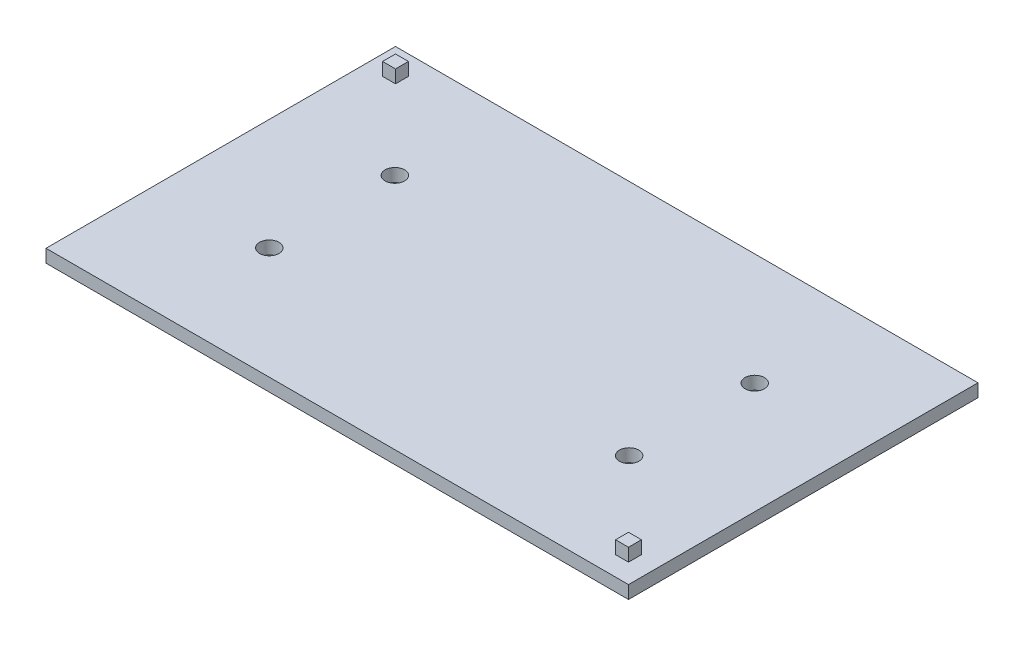
ISO-10303-21;
HEADER;
FILE_DESCRIPTION(('STEP AP214'),'2;1');
FILE_NAME('part.step','',(''),(''),'','','');
FILE_SCHEMA(('AUTOMOTIVE_DESIGN { 1 0 10303 214 1 1 1 1 }'));
ENDSEC;
DATA;
#1=APPLICATION_CONTEXT('core data for automotive mechanical design processes');
#2=APPLICATION_PROTOCOL_DEFINITION('international standard','automotive_design',2000,#1);
#3=PRODUCT_CONTEXT('',#1,'mechanical');
#4=PRODUCT('Part','Part','',(#3));
#5=PRODUCT_RELATED_PRODUCT_CATEGORY('part','',(#4));
#6=PRODUCT_DEFINITION_FORMATION('','',#4);
#7=PRODUCT_DEFINITION_CONTEXT('part definition',#1,'design');
#8=PRODUCT_DEFINITION('design','',#6,#7);
#9=PRODUCT_DEFINITION_SHAPE('','',#8);
#10=(LENGTH_UNIT() NAMED_UNIT(*) SI_UNIT(.MILLI.,.METRE.));
#11=(NAMED_UNIT(*) PLANE_ANGLE_UNIT() SI_UNIT($,.RADIAN.));
#12=(NAMED_UNIT(*) SI_UNIT($,.STERADIAN.) SOLID_ANGLE_UNIT());
#13=UNCERTAINTY_MEASURE_WITH_UNIT(LENGTH_MEASURE(1.E-05),#10,'distance_accuracy_value','');
#14=(GEOMETRIC_REPRESENTATION_CONTEXT(3) GLOBAL_UNCERTAINTY_ASSIGNED_CONTEXT((#13)) GLOBAL_UNIT_ASSIGNED_CONTEXT((#10,
#11,#12)) REPRESENTATION_CONTEXT('',''));
#15=CARTESIAN_POINT('',(0.,0.,0.));
#16=DIRECTION('',(0.,0.,1.));
#17=DIRECTION('',(1.,0.,0.));
#18=AXIS2_PLACEMENT_3D('',#15,#16,#17);
#19=CARTESIAN_POINT('',(0.,3.,0.));
#20=DIRECTION('',(0.,-1.,0.));
#21=DIRECTION('',(0.,0.,-1.));
#22=AXIS2_PLACEMENT_3D('',#19,#20,#21);
#23=PLANE('',#22);
#24=DIRECTION('',(1.,0.,0.));
#25=VECTOR('',#24,1.);
#26=CARTESIAN_POINT('',(0.,3.,-24.));
#27=LINE('',#26,#25);
#28=CARTESIAN_POINT('',(-42.,3.,-24.));
#29=VERTEX_POINT('',#28);
#30=CARTESIAN_POINT('',(-40.,3.,-24.));
#31=VERTEX_POINT('',#30);
#32=EDGE_CURVE('E110',#29,#31,#27,.T.);
#33=ORIENTED_EDGE('',*,*,#32,.T.);
#34=DIRECTION('',(0.,0.,1.));
#35=VECTOR('',#34,1.);
#36=CARTESIAN_POINT('',(-40.,3.,0.));
#37=LINE('',#36,#35);
#38=CARTESIAN_POINT('',(-40.,3.,-22.));
#39=VERTEX_POINT('',#38);
#40=EDGE_CURVE('E213',#31,#39,#37,.T.);
#41=ORIENTED_EDGE('',*,*,#40,.T.);
#42=DIRECTION('',(1.,0.,0.));
#43=VECTOR('',#42,1.);
#44=CARTESIAN_POINT('',(0.,3.,-22.));
#45=LINE('',#44,#43);
#46=CARTESIAN_POINT('',(-42.,3.,-22.));
#47=VERTEX_POINT('',#46);
#48=EDGE_CURVE('E198',#47,#39,#45,.T.);
#49=ORIENTED_EDGE('',*,*,#48,.F.);
#50=DIRECTION('',(0.,0.,1.));
#51=VECTOR('',#50,1.);
#52=CARTESIAN_POINT('',(-42.,3.,0.));
#53=LINE('',#52,#51);
#54=EDGE_CURVE('E115',#29,#47,#53,.T.);
#55=ORIENTED_EDGE('',*,*,#54,.F.);
#56=EDGE_LOOP('',(#33,#41,#49,#55));
#57=FACE_BOUND('',#56,.T.);
#58=DIRECTION('',(1.,0.,0.));
#59=VECTOR('',#58,1.);
#60=CARTESIAN_POINT('',(0.,3.,24.));
#61=LINE('',#60,#59);
#62=CARTESIAN_POINT('',(40.,3.,24.));
#63=VERTEX_POINT('',#62);
#64=CARTESIAN_POINT('',(42.,3.,24.));
#65=VERTEX_POINT('',#64);
#66=EDGE_CURVE('E242',#63,#65,#61,.T.);
#67=ORIENTED_EDGE('',*,*,#66,.F.);
#68=DIRECTION('',(0.,0.,-1.));
#69=VECTOR('',#68,1.);
#70=CARTESIAN_POINT('',(40.,3.,0.));
#71=LINE('',#70,#69);
#72=CARTESIAN_POINT('',(40.,3.,22.));
#73=VERTEX_POINT('',#72);
#74=EDGE_CURVE('E245',#63,#73,#71,.T.);
#75=ORIENTED_EDGE('',*,*,#74,.T.);
#76=DIRECTION('',(-1.,0.,0.));
#77=VECTOR('',#76,1.);
#78=CARTESIAN_POINT('',(0.,3.,22.));
#79=LINE('',#78,#77);
#80=CARTESIAN_POINT('',(42.,3.,22.));
#81=VERTEX_POINT('',#80);
#82=EDGE_CURVE('E237',#81,#73,#79,.T.);
#83=ORIENTED_EDGE('',*,*,#82,.F.);
#84=DIRECTION('',(0.,0.,1.));
#85=VECTOR('',#84,1.);
#86=CARTESIAN_POINT('',(42.,3.,0.));
#87=LINE('',#86,#85);
#88=EDGE_CURVE('E240',#81,#65,#87,.T.);
#89=ORIENTED_EDGE('',*,*,#88,.T.);
#90=EDGE_LOOP('',(#67,#75,#83,#89));
#91=FACE_BOUND('',#90,.T.);
#92=DIRECTION('',(1.,0.,0.));
#93=VECTOR('',#92,1.);
#94=CARTESIAN_POINT('',(-45.,3.,27.));
#95=LINE('',#94,#93);
#96=CARTESIAN_POINT('',(-45.,3.,27.));
#97=VERTEX_POINT('',#96);
#98=CARTESIAN_POINT('',(45.,3.,27.));
#99=VERTEX_POINT('',#98);
#100=EDGE_CURVE('E272',#97,#99,#95,.T.);
#101=ORIENTED_EDGE('',*,*,#100,.T.);
#102=DIRECTION('',(0.,0.,1.));
#103=VECTOR('',#102,1.);
#104=CARTESIAN_POINT('',(45.,3.,-27.));
#105=LINE('',#104,#103);
#106=CARTESIAN_POINT('',(45.,3.,-27.));
#107=VERTEX_POINT('',#106);
#108=EDGE_CURVE('E274',#107,#99,#105,.T.);
#109=ORIENTED_EDGE('',*,*,#108,.F.);
#110=DIRECTION('',(1.,0.,0.));
#111=VECTOR('',#110,1.);
#112=CARTESIAN_POINT('',(-45.,3.,-27.));
#113=LINE('',#112,#111);
#114=CARTESIAN_POINT('',(-45.,3.,-27.));
#115=VERTEX_POINT('',#114);
#116=EDGE_CURVE('E278',#115,#107,#113,.T.);
#117=ORIENTED_EDGE('',*,*,#116,.F.);
#118=DIRECTION('',(0.,0.,1.));
#119=VECTOR('',#118,1.);
#120=CARTESIAN_POINT('',(-45.,3.,-27.));
#121=LINE('',#120,#119);
#122=EDGE_CURVE('E281',#115,#97,#121,.T.);
#123=ORIENTED_EDGE('',*,*,#122,.T.);
#124=EDGE_LOOP('',(#101,#109,#117,#123));
#125=FACE_BOUND('',#124,.T.);
#126=CARTESIAN_POINT('',(-27.8,3.,-9.7));
#127=DIRECTION('',(0.,1.,0.));
#128=DIRECTION('',(0.,0.,1.));
#129=AXIS2_PLACEMENT_3D('',#126,#127,#128);
#130=CIRCLE('',#129,1.5);
#131=CARTESIAN_POINT('',(-27.8,3.,-8.2));
#132=VERTEX_POINT('',#131);
#133=EDGE_CURVE('E266',#132,#132,#130,.T.);
#134=ORIENTED_EDGE('',*,*,#133,.F.);
#135=EDGE_LOOP('',(#134));
#136=FACE_BOUND('',#135,.T.);
#137=CARTESIAN_POINT('',(-27.8,3.,9.7));
#138=DIRECTION('',(0.,1.,0.));
#139=DIRECTION('',(0.,0.,1.));
#140=AXIS2_PLACEMENT_3D('',#137,#138,#139);
#141=CIRCLE('',#140,1.5);
#142=CARTESIAN_POINT('',(-27.8,3.,11.2));
#143=VERTEX_POINT('',#142);
#144=EDGE_CURVE('E260',#143,#143,#141,.T.);
#145=ORIENTED_EDGE('',*,*,#144,.F.);
#146=EDGE_LOOP('',(#145));
#147=FACE_BOUND('',#146,.T.);
#148=CARTESIAN_POINT('',(27.8,3.,9.70000000000001));
#149=DIRECTION('',(0.,1.,0.));
#150=DIRECTION('',(0.,0.,1.));
#151=AXIS2_PLACEMENT_3D('',#148,#149,#150);
#152=CIRCLE('',#151,1.5);
#153=CARTESIAN_POINT('',(27.8,3.,11.2));
#154=VERTEX_POINT('',#153);
#155=EDGE_CURVE('E254',#154,#154,#152,.T.);
#156=ORIENTED_EDGE('',*,*,#155,.F.);
#157=EDGE_LOOP('',(#156));
#158=FACE_BOUND('',#157,.T.);
#159=CARTESIAN_POINT('',(27.8,3.,-9.7));
#160=DIRECTION('',(0.,1.,0.));
#161=DIRECTION('',(0.,0.,1.));
#162=AXIS2_PLACEMENT_3D('',#159,#160,#161);
#163=CIRCLE('',#162,1.5);
#164=CARTESIAN_POINT('',(27.8,3.,-8.2));
#165=VERTEX_POINT('',#164);
#166=EDGE_CURVE('E248',#165,#165,#163,.T.);
#167=ORIENTED_EDGE('',*,*,#166,.F.);
#168=EDGE_LOOP('',(#167));
#169=FACE_BOUND('',#168,.T.);
#170=ADVANCED_FACE('F95',(#57,#91,#125,#136,#147,#158,#169),#23,.F.);
#171=CARTESIAN_POINT('',(0.,1.,0.));
#172=DIRECTION('',(0.,-1.,0.));
#173=DIRECTION('',(0.,0.,-1.));
#174=AXIS2_PLACEMENT_3D('',#171,#172,#173);
#175=PLANE('',#174);
#176=CARTESIAN_POINT('',(27.8,1.,9.70000000000001));
#177=DIRECTION('',(0.,1.,0.));
#178=DIRECTION('',(0.,0.,1.));
#179=AXIS2_PLACEMENT_3D('',#176,#177,#178);
#180=CIRCLE('',#179,1.5);
#181=CARTESIAN_POINT('',(27.8,1.,11.2));
#182=VERTEX_POINT('',#181);
#183=EDGE_CURVE('E251',#182,#182,#180,.T.);
#184=ORIENTED_EDGE('',*,*,#183,.T.);
#185=EDGE_LOOP('',(#184));
#186=FACE_BOUND('',#185,.T.);
#187=CARTESIAN_POINT('',(-27.8,1.,-9.7));
#188=DIRECTION('',(0.,1.,0.));
#189=DIRECTION('',(0.,0.,1.));
#190=AXIS2_PLACEMENT_3D('',#187,#188,#189);
#191=CIRCLE('',#190,1.5);
#192=CARTESIAN_POINT('',(-27.8,1.,-8.2));
#193=VERTEX_POINT('',#192);
#194=EDGE_CURVE('E263',#193,#193,#191,.T.);
#195=ORIENTED_EDGE('',*,*,#194,.T.);
#196=EDGE_LOOP('',(#195));
#197=FACE_BOUND('',#196,.T.);
#198=DIRECTION('',(1.,0.,0.));
#199=VECTOR('',#198,1.);
#200=CARTESIAN_POINT('',(-45.,1.,27.));
#201=LINE('',#200,#199);
#202=CARTESIAN_POINT('',(-45.,1.,27.));
#203=VERTEX_POINT('',#202);
#204=CARTESIAN_POINT('',(45.,1.,27.));
#205=VERTEX_POINT('',#204);
#206=EDGE_CURVE('E269',#203,#205,#201,.T.);
#207=ORIENTED_EDGE('',*,*,#206,.F.);
#208=DIRECTION('',(0.,0.,1.));
#209=VECTOR('',#208,1.);
#210=CARTESIAN_POINT('',(-45.,1.,-27.));
#211=LINE('',#210,#209);
#212=CARTESIAN_POINT('',(-45.,1.,-27.));
#213=VERTEX_POINT('',#212);
#214=EDGE_CURVE('E275',#213,#203,#211,.T.);
#215=ORIENTED_EDGE('',*,*,#214,.F.);
#216=DIRECTION('',(1.,0.,0.));
#217=VECTOR('',#216,1.);
#218=CARTESIAN_POINT('',(-45.,1.,-27.));
#219=LINE('',#218,#217);
#220=CARTESIAN_POINT('',(45.,1.,-27.));
#221=VERTEX_POINT('',#220);
#222=EDGE_CURVE('E289',#213,#221,#219,.T.);
#223=ORIENTED_EDGE('',*,*,#222,.T.);
#224=DIRECTION('',(0.,0.,1.));
#225=VECTOR('',#224,1.);
#226=CARTESIAN_POINT('',(45.,1.,-27.));
#227=LINE('',#226,#225);
#228=EDGE_CURVE('E286',#221,#205,#227,.T.);
#229=ORIENTED_EDGE('',*,*,#228,.T.);
#230=EDGE_LOOP('',(#207,#215,#223,#229));
#231=FACE_BOUND('',#230,.T.);
#232=CARTESIAN_POINT('',(-27.8,1.,9.7));
#233=DIRECTION('',(0.,1.,0.));
#234=DIRECTION('',(0.,0.,1.));
#235=AXIS2_PLACEMENT_3D('',#232,#233,#234);
#236=CIRCLE('',#235,1.5);
#237=CARTESIAN_POINT('',(-27.8,1.,11.2));
#238=VERTEX_POINT('',#237);
#239=EDGE_CURVE('E257',#238,#238,#236,.T.);
#240=ORIENTED_EDGE('',*,*,#239,.T.);
#241=EDGE_LOOP('',(#240));
#242=FACE_BOUND('',#241,.T.);
#243=CARTESIAN_POINT('',(27.8,1.,-9.7));
#244=DIRECTION('',(0.,1.,0.));
#245=DIRECTION('',(0.,0.,1.));
#246=AXIS2_PLACEMENT_3D('',#243,#244,#245);
#247=CIRCLE('',#246,1.5);
#248=CARTESIAN_POINT('',(27.8,1.,-8.2));
#249=VERTEX_POINT('',#248);
#250=EDGE_CURVE('E247',#249,#249,#247,.T.);
#251=ORIENTED_EDGE('',*,*,#250,.T.);
#252=EDGE_LOOP('',(#251));
#253=FACE_BOUND('',#252,.T.);
#254=ADVANCED_FACE('F308',(#186,#197,#231,#242,#253),#175,.T.);
#255=CARTESIAN_POINT('',(-45.,3.,27.));
#256=DIRECTION('',(0.,0.,-1.));
#257=DIRECTION('',(-1.,0.,0.));
#258=AXIS2_PLACEMENT_3D('',#255,#256,#257);
#259=PLANE('',#258);
#260=ORIENTED_EDGE('',*,*,#206,.T.);
#261=DIRECTION('',(0.,-1.,0.));
#262=VECTOR('',#261,1.);
#263=CARTESIAN_POINT('',(45.,3.,27.));
#264=LINE('',#263,#262);
#265=EDGE_CURVE('E12',#99,#205,#264,.T.);
#266=ORIENTED_EDGE('',*,*,#265,.F.);
#267=ORIENTED_EDGE('',*,*,#100,.F.);
#268=DIRECTION('',(0.,-1.,0.));
#269=VECTOR('',#268,1.);
#270=CARTESIAN_POINT('',(-45.,3.,27.));
#271=LINE('',#270,#269);
#272=EDGE_CURVE('E283',#97,#203,#271,.T.);
#273=ORIENTED_EDGE('',*,*,#272,.T.);
#274=EDGE_LOOP('',(#260,#266,#267,#273));
#275=FACE_BOUND('',#274,.T.);
#276=ADVANCED_FACE('F97',(#275),#259,.F.);
#277=CARTESIAN_POINT('',(45.,3.,-27.));
#278=DIRECTION('',(1.,0.,0.));
#279=DIRECTION('',(0.,0.,-1.));
#280=AXIS2_PLACEMENT_3D('',#277,#278,#279);
#281=PLANE('',#280);
#282=ORIENTED_EDGE('',*,*,#228,.F.);
#283=DIRECTION('',(0.,-1.,0.));
#284=VECTOR('',#283,1.);
#285=CARTESIAN_POINT('',(45.,3.,-27.));
#286=LINE('',#285,#284);
#287=EDGE_CURVE('E103',#107,#221,#286,.T.);
#288=ORIENTED_EDGE('',*,*,#287,.F.);
#289=ORIENTED_EDGE('',*,*,#108,.T.);
#290=ORIENTED_EDGE('',*,*,#265,.T.);
#291=EDGE_LOOP('',(#282,#288,#289,#290));
#292=FACE_BOUND('',#291,.T.);
#293=ADVANCED_FACE('F303',(#292),#281,.T.);
#294=CARTESIAN_POINT('',(-45.,3.,-27.));
#295=DIRECTION('',(0.,0.,-1.));
#296=DIRECTION('',(-1.,0.,0.));
#297=AXIS2_PLACEMENT_3D('',#294,#295,#296);
#298=PLANE('',#297);
#299=ORIENTED_EDGE('',*,*,#222,.F.);
#300=DIRECTION('',(0.,-1.,0.));
#301=VECTOR('',#300,1.);
#302=CARTESIAN_POINT('',(-45.,3.,-27.));
#303=LINE('',#302,#301);
#304=EDGE_CURVE('E295',#115,#213,#303,.T.);
#305=ORIENTED_EDGE('',*,*,#304,.F.);
#306=ORIENTED_EDGE('',*,*,#116,.T.);
#307=ORIENTED_EDGE('',*,*,#287,.T.);
#308=EDGE_LOOP('',(#299,#305,#306,#307));
#309=FACE_BOUND('',#308,.T.);
#310=ADVANCED_FACE('F299',(#309),#298,.T.);
#311=CARTESIAN_POINT('',(-45.,3.,-27.));
#312=DIRECTION('',(1.,0.,0.));
#313=DIRECTION('',(0.,0.,-1.));
#314=AXIS2_PLACEMENT_3D('',#311,#312,#313);
#315=PLANE('',#314);
#316=ORIENTED_EDGE('',*,*,#214,.T.);
#317=ORIENTED_EDGE('',*,*,#272,.F.);
#318=ORIENTED_EDGE('',*,*,#122,.F.);
#319=ORIENTED_EDGE('',*,*,#304,.T.);
#320=EDGE_LOOP('',(#316,#317,#318,#319));
#321=FACE_BOUND('',#320,.T.);
#322=ADVANCED_FACE('F312',(#321),#315,.F.);
#323=CARTESIAN_POINT('',(-27.8,3.,-9.7));
#324=DIRECTION('',(0.,-1.,0.));
#325=DIRECTION('',(0.,0.,-1.));
#326=AXIS2_PLACEMENT_3D('',#323,#324,#325);
#327=CYLINDRICAL_SURFACE('',#326,1.5);
#328=ORIENTED_EDGE('',*,*,#133,.T.);
#329=EDGE_LOOP('',(#328));
#330=FACE_BOUND('',#329,.T.);
#331=ORIENTED_EDGE('',*,*,#194,.F.);
#332=EDGE_LOOP('',(#331));
#333=FACE_BOUND('',#332,.T.);
#334=ADVANCED_FACE('F347',(#330,#333),#327,.F.);
#335=CARTESIAN_POINT('',(-27.8,3.,9.7));
#336=DIRECTION('',(0.,-1.,0.));
#337=DIRECTION('',(0.,0.,-1.));
#338=AXIS2_PLACEMENT_3D('',#335,#336,#337);
#339=CYLINDRICAL_SURFACE('',#338,1.5);
#340=ORIENTED_EDGE('',*,*,#144,.T.);
#341=EDGE_LOOP('',(#340));
#342=FACE_BOUND('',#341,.T.);
#343=ORIENTED_EDGE('',*,*,#239,.F.);
#344=EDGE_LOOP('',(#343));
#345=FACE_BOUND('',#344,.T.);
#346=ADVANCED_FACE('F368',(#342,#345),#339,.F.);
#347=CARTESIAN_POINT('',(27.8,3.,9.70000000000001));
#348=DIRECTION('',(0.,-1.,0.));
#349=DIRECTION('',(0.,0.,-1.));
#350=AXIS2_PLACEMENT_3D('',#347,#348,#349);
#351=CYLINDRICAL_SURFACE('',#350,1.5);
#352=ORIENTED_EDGE('',*,*,#155,.T.);
#353=EDGE_LOOP('',(#352));
#354=FACE_BOUND('',#353,.T.);
#355=ORIENTED_EDGE('',*,*,#183,.F.);
#356=EDGE_LOOP('',(#355));
#357=FACE_BOUND('',#356,.T.);
#358=ADVANCED_FACE('F332',(#354,#357),#351,.F.);
#359=CARTESIAN_POINT('',(27.8,3.,-9.7));
#360=DIRECTION('',(0.,-1.,0.));
#361=DIRECTION('',(0.,0.,-1.));
#362=AXIS2_PLACEMENT_3D('',#359,#360,#361);
#363=CYLINDRICAL_SURFACE('',#362,1.5);
#364=ORIENTED_EDGE('',*,*,#166,.T.);
#365=EDGE_LOOP('',(#364));
#366=FACE_BOUND('',#365,.T.);
#367=ORIENTED_EDGE('',*,*,#250,.F.);
#368=EDGE_LOOP('',(#367));
#369=FACE_BOUND('',#368,.T.);
#370=ADVANCED_FACE('F328',(#366,#369),#363,.F.);
#371=CARTESIAN_POINT('',(40.,5.,0.));
#372=DIRECTION('',(-1.,0.,0.));
#373=DIRECTION('',(0.,0.,1.));
#374=AXIS2_PLACEMENT_3D('',#371,#372,#373);
#375=PLANE('',#374);
#376=ORIENTED_EDGE('',*,*,#74,.F.);
#377=DIRECTION('',(0.,-1.,0.));
#378=VECTOR('',#377,1.);
#379=CARTESIAN_POINT('',(40.,5.,24.));
#380=LINE('',#379,#378);
#381=CARTESIAN_POINT('',(40.,5.,24.));
#382=VERTEX_POINT('',#381);
#383=EDGE_CURVE('E234',#382,#63,#380,.T.);
#384=ORIENTED_EDGE('',*,*,#383,.F.);
#385=DIRECTION('',(0.,0.,-1.));
#386=VECTOR('',#385,1.);
#387=CARTESIAN_POINT('',(40.,5.,0.));
#388=LINE('',#387,#386);
#389=CARTESIAN_POINT('',(40.,5.,22.));
#390=VERTEX_POINT('',#389);
#391=EDGE_CURVE('E215',#382,#390,#388,.T.);
#392=ORIENTED_EDGE('',*,*,#391,.T.);
#393=DIRECTION('',(0.,-1.,0.));
#394=VECTOR('',#393,1.);
#395=CARTESIAN_POINT('',(40.,5.,22.));
#396=LINE('',#395,#394);
#397=EDGE_CURVE('E225',#390,#73,#396,.T.);
#398=ORIENTED_EDGE('',*,*,#397,.T.);
#399=EDGE_LOOP('',(#376,#384,#392,#398));
#400=FACE_BOUND('',#399,.T.);
#401=ADVANCED_FACE('F331',(#400),#375,.T.);
#402=CARTESIAN_POINT('',(0.,5.,24.));
#403=DIRECTION('',(0.,0.,-1.));
#404=DIRECTION('',(-1.,0.,0.));
#405=AXIS2_PLACEMENT_3D('',#402,#403,#404);
#406=PLANE('',#405);
#407=ORIENTED_EDGE('',*,*,#383,.T.);
#408=ORIENTED_EDGE('',*,*,#66,.T.);
#409=DIRECTION('',(0.,-1.,0.));
#410=VECTOR('',#409,1.);
#411=CARTESIAN_POINT('',(42.,5.,24.));
#412=LINE('',#411,#410);
#413=CARTESIAN_POINT('',(42.,5.,24.));
#414=VERTEX_POINT('',#413);
#415=EDGE_CURVE('E231',#414,#65,#412,.T.);
#416=ORIENTED_EDGE('',*,*,#415,.F.);
#417=DIRECTION('',(1.,0.,0.));
#418=VECTOR('',#417,1.);
#419=CARTESIAN_POINT('',(0.,5.,24.));
#420=LINE('',#419,#418);
#421=EDGE_CURVE('E218',#382,#414,#420,.T.);
#422=ORIENTED_EDGE('',*,*,#421,.F.);
#423=EDGE_LOOP('',(#407,#408,#416,#422));
#424=FACE_BOUND('',#423,.T.);
#425=ADVANCED_FACE('F394',(#424),#406,.F.);
#426=CARTESIAN_POINT('',(42.,5.,0.));
#427=DIRECTION('',(1.,0.,0.));
#428=DIRECTION('',(0.,0.,-1.));
#429=AXIS2_PLACEMENT_3D('',#426,#427,#428);
#430=PLANE('',#429);
#431=ORIENTED_EDGE('',*,*,#88,.F.);
#432=DIRECTION('',(0.,-1.,0.));
#433=VECTOR('',#432,1.);
#434=CARTESIAN_POINT('',(42.,5.,22.));
#435=LINE('',#434,#433);
#436=CARTESIAN_POINT('',(42.,5.,22.));
#437=VERTEX_POINT('',#436);
#438=EDGE_CURVE('E228',#437,#81,#435,.T.);
#439=ORIENTED_EDGE('',*,*,#438,.F.);
#440=DIRECTION('',(0.,0.,1.));
#441=VECTOR('',#440,1.);
#442=CARTESIAN_POINT('',(42.,5.,0.));
#443=LINE('',#442,#441);
#444=EDGE_CURVE('E220',#437,#414,#443,.T.);
#445=ORIENTED_EDGE('',*,*,#444,.T.);
#446=ORIENTED_EDGE('',*,*,#415,.T.);
#447=EDGE_LOOP('',(#431,#439,#445,#446));
#448=FACE_BOUND('',#447,.T.);
#449=ADVANCED_FACE('F402',(#448),#430,.T.);
#450=CARTESIAN_POINT('',(0.,5.,22.));
#451=DIRECTION('',(0.,0.,1.));
#452=DIRECTION('',(1.,0.,0.));
#453=AXIS2_PLACEMENT_3D('',#450,#451,#452);
#454=PLANE('',#453);
#455=ORIENTED_EDGE('',*,*,#438,.T.);
#456=ORIENTED_EDGE('',*,*,#82,.T.);
#457=ORIENTED_EDGE('',*,*,#397,.F.);
#458=DIRECTION('',(-1.,0.,0.));
#459=VECTOR('',#458,1.);
#460=CARTESIAN_POINT('',(0.,5.,22.));
#461=LINE('',#460,#459);
#462=EDGE_CURVE('E223',#437,#390,#461,.T.);
#463=ORIENTED_EDGE('',*,*,#462,.F.);
#464=EDGE_LOOP('',(#455,#456,#457,#463));
#465=FACE_BOUND('',#464,.T.);
#466=ADVANCED_FACE('F410',(#465),#454,.F.);
#467=CARTESIAN_POINT('',(0.,5.,0.));
#468=DIRECTION('',(0.,1.,0.));
#469=DIRECTION('',(0.,0.,1.));
#470=AXIS2_PLACEMENT_3D('',#467,#468,#469);
#471=PLANE('',#470);
#472=ORIENTED_EDGE('',*,*,#391,.F.);
#473=ORIENTED_EDGE('',*,*,#421,.T.);
#474=ORIENTED_EDGE('',*,*,#444,.F.);
#475=ORIENTED_EDGE('',*,*,#462,.T.);
#476=EDGE_LOOP('',(#472,#473,#474,#475));
#477=FACE_BOUND('',#476,.T.);
#478=ADVANCED_FACE('F418',(#477),#471,.T.);
#479=CARTESIAN_POINT('',(-40.,5.,0.));
#480=DIRECTION('',(1.,0.,0.));
#481=DIRECTION('',(0.,0.,-1.));
#482=AXIS2_PLACEMENT_3D('',#479,#480,#481);
#483=PLANE('',#482);
#484=ORIENTED_EDGE('',*,*,#40,.F.);
#485=DIRECTION('',(0.,-1.,0.));
#486=VECTOR('',#485,1.);
#487=CARTESIAN_POINT('',(-40.,5.,-24.));
#488=LINE('',#487,#486);
#489=CARTESIAN_POINT('',(-40.,5.,-24.));
#490=VERTEX_POINT('',#489);
#491=EDGE_CURVE('E204',#490,#31,#488,.T.);
#492=ORIENTED_EDGE('',*,*,#491,.F.);
#493=DIRECTION('',(0.,0.,1.));
#494=VECTOR('',#493,1.);
#495=CARTESIAN_POINT('',(-40.,5.,0.));
#496=LINE('',#495,#494);
#497=CARTESIAN_POINT('',(-40.,5.,-22.));
#498=VERTEX_POINT('',#497);
#499=EDGE_CURVE('E186',#490,#498,#496,.T.);
#500=ORIENTED_EDGE('',*,*,#499,.T.);
#501=DIRECTION('',(0.,-1.,0.));
#502=VECTOR('',#501,1.);
#503=CARTESIAN_POINT('',(-40.,5.,-22.));
#504=LINE('',#503,#502);
#505=EDGE_CURVE('E193',#498,#39,#504,.T.);
#506=ORIENTED_EDGE('',*,*,#505,.T.);
#507=EDGE_LOOP('',(#484,#492,#500,#506));
#508=FACE_BOUND('',#507,.T.);
#509=ADVANCED_FACE('F202',(#508),#483,.T.);
#510=CARTESIAN_POINT('',(0.,5.,-24.));
#511=DIRECTION('',(0.,0.,-1.));
#512=DIRECTION('',(-1.,0.,0.));
#513=AXIS2_PLACEMENT_3D('',#510,#511,#512);
#514=PLANE('',#513);
#515=ORIENTED_EDGE('',*,*,#32,.F.);
#516=DIRECTION('',(0.,-1.,0.));
#517=VECTOR('',#516,1.);
#518=CARTESIAN_POINT('',(-42.,5.,-24.));
#519=LINE('',#518,#517);
#520=CARTESIAN_POINT('',(-42.,5.,-24.));
#521=VERTEX_POINT('',#520);
#522=EDGE_CURVE('E511',#521,#29,#519,.T.);
#523=ORIENTED_EDGE('',*,*,#522,.F.);
#524=DIRECTION('',(1.,0.,0.));
#525=VECTOR('',#524,1.);
#526=CARTESIAN_POINT('',(0.,5.,-24.));
#527=LINE('',#526,#525);
#528=EDGE_CURVE('E205',#521,#490,#527,.T.);
#529=ORIENTED_EDGE('',*,*,#528,.T.);
#530=ORIENTED_EDGE('',*,*,#491,.T.);
#531=EDGE_LOOP('',(#515,#523,#529,#530));
#532=FACE_BOUND('',#531,.T.);
#533=ADVANCED_FACE('F433',(#532),#514,.T.);
#534=CARTESIAN_POINT('',(-42.,5.,0.));
#535=DIRECTION('',(1.,0.,0.));
#536=DIRECTION('',(0.,0.,-1.));
#537=AXIS2_PLACEMENT_3D('',#534,#535,#536);
#538=PLANE('',#537);
#539=ORIENTED_EDGE('',*,*,#522,.T.);
#540=ORIENTED_EDGE('',*,*,#54,.T.);
#541=DIRECTION('',(0.,-1.,0.));
#542=VECTOR('',#541,1.);
#543=CARTESIAN_POINT('',(-42.,5.,-22.));
#544=LINE('',#543,#542);
#545=CARTESIAN_POINT('',(-42.,5.,-22.));
#546=VERTEX_POINT('',#545);
#547=EDGE_CURVE('E200',#546,#47,#544,.T.);
#548=ORIENTED_EDGE('',*,*,#547,.F.);
#549=DIRECTION('',(0.,0.,1.));
#550=VECTOR('',#549,1.);
#551=CARTESIAN_POINT('',(-42.,5.,0.));
#552=LINE('',#551,#550);
#553=EDGE_CURVE('E189',#521,#546,#552,.T.);
#554=ORIENTED_EDGE('',*,*,#553,.F.);
#555=EDGE_LOOP('',(#539,#540,#548,#554));
#556=FACE_BOUND('',#555,.T.);
#557=ADVANCED_FACE('F440',(#556),#538,.F.);
#558=CARTESIAN_POINT('',(0.,5.,-22.));
#559=DIRECTION('',(0.,0.,-1.));
#560=DIRECTION('',(-1.,0.,0.));
#561=AXIS2_PLACEMENT_3D('',#558,#559,#560);
#562=PLANE('',#561);
#563=ORIENTED_EDGE('',*,*,#547,.T.);
#564=ORIENTED_EDGE('',*,*,#48,.T.);
#565=ORIENTED_EDGE('',*,*,#505,.F.);
#566=DIRECTION('',(1.,0.,0.));
#567=VECTOR('',#566,1.);
#568=CARTESIAN_POINT('',(0.,5.,-22.));
#569=LINE('',#568,#567);
#570=EDGE_CURVE('E181',#546,#498,#569,.T.);
#571=ORIENTED_EDGE('',*,*,#570,.F.);
#572=EDGE_LOOP('',(#563,#564,#565,#571));
#573=FACE_BOUND('',#572,.T.);
#574=ADVANCED_FACE('F197',(#573),#562,.F.);
#575=CARTESIAN_POINT('',(0.,5.,0.));
#576=DIRECTION('',(0.,1.,0.));
#577=DIRECTION('',(0.,0.,1.));
#578=AXIS2_PLACEMENT_3D('',#575,#576,#577);
#579=PLANE('',#578);
#580=ORIENTED_EDGE('',*,*,#499,.F.);
#581=ORIENTED_EDGE('',*,*,#528,.F.);
#582=ORIENTED_EDGE('',*,*,#553,.T.);
#583=ORIENTED_EDGE('',*,*,#570,.T.);
#584=EDGE_LOOP('',(#580,#581,#582,#583));
#585=FACE_BOUND('',#584,.T.);
#586=ADVANCED_FACE('F183',(#585),#579,.T.);
#587=CLOSED_SHELL('',(#170,#254,#276,#293,#310,#322,#334,#346,#358,#370,#401,#425,#449,#466,
#478,#509,#533,#557,#574,#586));
#588=MANIFOLD_SOLID_BREP('B2',#587);
#589=ADVANCED_BREP_SHAPE_REPRESENTATION('',(#18,#588),#14);
#590=SHAPE_DEFINITION_REPRESENTATION(#9,#589);
ENDSEC;
END-ISO-10303-21;
